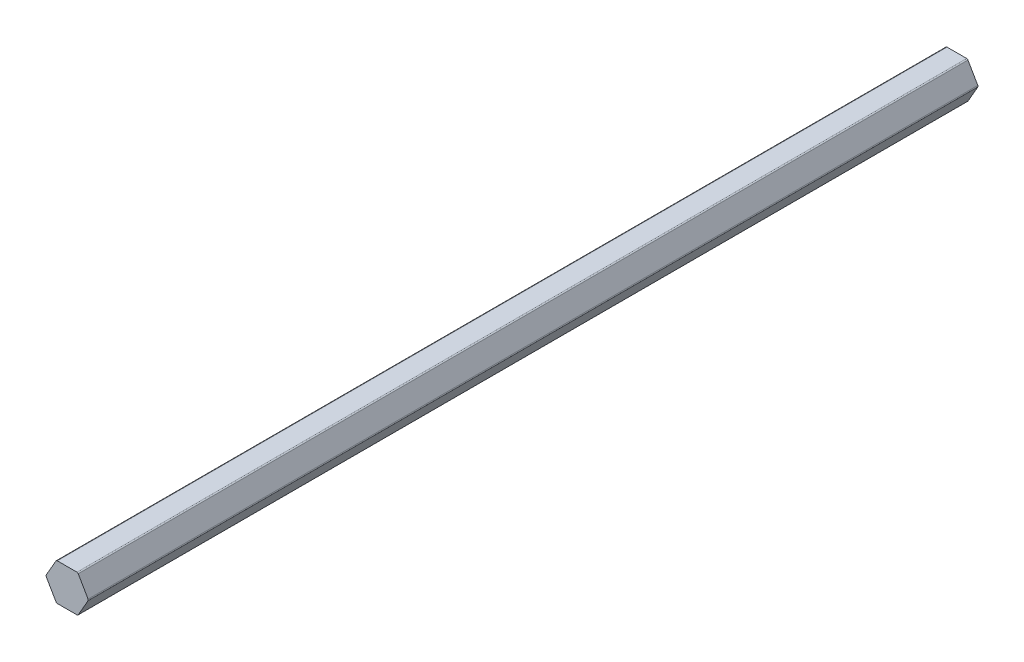
ISO-10303-21;
HEADER;
FILE_DESCRIPTION(('STEP AP214'),'2;1');
FILE_NAME('part.step','',(''),(''),'','','');
FILE_SCHEMA(('AUTOMOTIVE_DESIGN { 1 0 10303 214 1 1 1 1 }'));
ENDSEC;
DATA;
#1=APPLICATION_CONTEXT('core data for automotive mechanical design processes');
#2=APPLICATION_PROTOCOL_DEFINITION('international standard','automotive_design',2000,#1);
#3=PRODUCT_CONTEXT('',#1,'mechanical');
#4=PRODUCT('Part','Part','',(#3));
#5=PRODUCT_RELATED_PRODUCT_CATEGORY('part','',(#4));
#6=PRODUCT_DEFINITION_FORMATION('','',#4);
#7=PRODUCT_DEFINITION_CONTEXT('part definition',#1,'design');
#8=PRODUCT_DEFINITION('design','',#6,#7);
#9=PRODUCT_DEFINITION_SHAPE('','',#8);
#10=(LENGTH_UNIT() NAMED_UNIT(*) SI_UNIT(.MILLI.,.METRE.));
#11=(NAMED_UNIT(*) PLANE_ANGLE_UNIT() SI_UNIT($,.RADIAN.));
#12=(NAMED_UNIT(*) SI_UNIT($,.STERADIAN.) SOLID_ANGLE_UNIT());
#13=UNCERTAINTY_MEASURE_WITH_UNIT(LENGTH_MEASURE(1.E-05),#10,'distance_accuracy_value','');
#14=(GEOMETRIC_REPRESENTATION_CONTEXT(3) GLOBAL_UNCERTAINTY_ASSIGNED_CONTEXT((#13)) GLOBAL_UNIT_ASSIGNED_CONTEXT((#10,
#11,#12)) REPRESENTATION_CONTEXT('',''));
#15=CARTESIAN_POINT('',(0.,0.,0.));
#16=DIRECTION('',(0.,0.,1.));
#17=DIRECTION('',(1.,0.,0.));
#18=AXIS2_PLACEMENT_3D('',#15,#16,#17);
#19=CARTESIAN_POINT('',(-6.73109584837417,0.,457.2));
#20=DIRECTION('',(0.,0.,-1.));
#21=DIRECTION('',(-1.,0.,0.));
#22=AXIS2_PLACEMENT_3D('',#19,#20,#21);
#23=CYLINDRICAL_SURFACE('',#22,0.508);
#24=CARTESIAN_POINT('',(-6.73109584837417,0.,-152.4));
#25=DIRECTION('',(0.,0.,-1.));
#26=DIRECTION('',(-1.,0.,0.));
#27=AXIS2_PLACEMENT_3D('',#24,#25,#26);
#28=CIRCLE('',#27,0.508);
#29=CARTESIAN_POINT('',(-7.23909584837417,0.,-152.4));
#30=VERTEX_POINT('',#29);
#31=CARTESIAN_POINT('',(-7.17103675349666,-0.254000000000007,-152.4));
#32=VERTEX_POINT('',#31);
#33=EDGE_CURVE('E264',#30,#32,#28,.F.);
#34=ORIENTED_EDGE('',*,*,#33,.F.);
#35=DIRECTION('',(0.,0.,-1.));
#36=VECTOR('',#35,1.);
#37=CARTESIAN_POINT('',(-7.23909584837417,0.,457.2));
#38=LINE('',#37,#36);
#39=CARTESIAN_POINT('',(-7.23909584837417,0.,-457.2));
#40=VERTEX_POINT('',#39);
#41=EDGE_CURVE('E52',#30,#40,#38,.T.);
#42=ORIENTED_EDGE('',*,*,#41,.T.);
#43=CARTESIAN_POINT('',(-6.73109584837417,0.,-457.2));
#44=DIRECTION('',(0.,0.,-1.));
#45=DIRECTION('',(1.,0.,0.));
#46=AXIS2_PLACEMENT_3D('',#43,#44,#45);
#47=CIRCLE('',#46,0.508);
#48=CARTESIAN_POINT('',(-7.17103675349666,-0.254000000000004,-457.2));
#49=VERTEX_POINT('',#48);
#50=EDGE_CURVE('E192',#49,#40,#47,.T.);
#51=ORIENTED_EDGE('',*,*,#50,.F.);
#52=DIRECTION('',(0.,0.,-1.));
#53=VECTOR('',#52,1.);
#54=CARTESIAN_POINT('',(-7.17103675349666,-0.254000000000004,457.2));
#55=LINE('',#54,#53);
#56=EDGE_CURVE('E217',#32,#49,#55,.T.);
#57=ORIENTED_EDGE('',*,*,#56,.F.);
#58=EDGE_LOOP('',(#34,#42,#51,#57));
#59=FACE_BOUND('',#58,.T.);
#60=ADVANCED_FACE('F44',(#59),#23,.T.);
#61=CARTESIAN_POINT('',(3.65884186093541,-6.3373,457.2));
#62=DIRECTION('',(-0.866025403784439,0.5,0.));
#63=DIRECTION('',(0.,0.,1.));
#64=AXIS2_PLACEMENT_3D('',#61,#62,#63);
#65=PLANE('',#64);
#66=DIRECTION('',(0.,0.,1.));
#67=VECTOR('',#66,1.);
#68=CARTESIAN_POINT('',(7.17103675349667,-0.253999999999996,457.2));
#69=LINE('',#68,#67);
#70=CARTESIAN_POINT('',(7.17103675349666,-0.254,-457.2));
#71=VERTEX_POINT('',#70);
#72=CARTESIAN_POINT('',(7.17103675349666,-0.254000000000001,-152.4));
#73=VERTEX_POINT('',#72);
#74=EDGE_CURVE('E179',#71,#73,#69,.T.);
#75=ORIENTED_EDGE('',*,*,#74,.T.);
#76=DIRECTION('',(-0.5,-0.866025403784439,0.));
#77=VECTOR('',#76,1.);
#78=CARTESIAN_POINT('',(3.65884186093541,-6.3373,-152.4));
#79=LINE('',#78,#77);
#80=CARTESIAN_POINT('',(3.80548882930958,-6.0833,-152.4));
#81=VERTEX_POINT('',#80);
#82=EDGE_CURVE('E254',#73,#81,#79,.T.);
#83=ORIENTED_EDGE('',*,*,#82,.T.);
#84=DIRECTION('',(0.,0.,-1.));
#85=VECTOR('',#84,1.);
#86=CARTESIAN_POINT('',(3.80548882930958,-6.0833,457.2));
#87=LINE('',#86,#85);
#88=CARTESIAN_POINT('',(3.80548882930958,-6.0833,-457.2));
#89=VERTEX_POINT('',#88);
#90=EDGE_CURVE('E209',#81,#89,#87,.T.);
#91=ORIENTED_EDGE('',*,*,#90,.T.);
#92=DIRECTION('',(0.5,0.866025403784439,0.));
#93=VECTOR('',#92,1.);
#94=CARTESIAN_POINT('',(3.65884186093541,-6.3373,-457.2));
#95=LINE('',#94,#93);
#96=EDGE_CURVE('E205',#89,#71,#95,.T.);
#97=ORIENTED_EDGE('',*,*,#96,.T.);
#98=EDGE_LOOP('',(#75,#83,#91,#97));
#99=FACE_BOUND('',#98,.T.);
#100=ADVANCED_FACE('F293',(#99),#65,.F.);
#101=CARTESIAN_POINT('',(7.31768372187083,0.,457.2));
#102=DIRECTION('',(-0.866025403784439,-0.5,0.));
#103=DIRECTION('',(-0.5,0.866025403784439,0.));
#104=AXIS2_PLACEMENT_3D('',#101,#102,#103);
#105=PLANE('',#104);
#106=DIRECTION('',(0.,0.,1.));
#107=VECTOR('',#106,1.);
#108=CARTESIAN_POINT('',(3.80548882930958,6.0833,457.2));
#109=LINE('',#108,#107);
#110=CARTESIAN_POINT('',(3.80548882930957,6.0833,-457.2));
#111=VERTEX_POINT('',#110);
#112=CARTESIAN_POINT('',(3.80548882930958,6.0833,-152.4));
#113=VERTEX_POINT('',#112);
#114=EDGE_CURVE('E187',#111,#113,#109,.T.);
#115=ORIENTED_EDGE('',*,*,#114,.T.);
#116=DIRECTION('',(0.5,-0.866025403784439,0.));
#117=VECTOR('',#116,1.);
#118=CARTESIAN_POINT('',(7.31768372187083,0.,-152.4));
#119=LINE('',#118,#117);
#120=CARTESIAN_POINT('',(7.17103675349667,0.254000000000004,-152.4));
#121=VERTEX_POINT('',#120);
#122=EDGE_CURVE('E58',#113,#121,#119,.T.);
#123=ORIENTED_EDGE('',*,*,#122,.T.);
#124=DIRECTION('',(0.,0.,-1.));
#125=VECTOR('',#124,1.);
#126=CARTESIAN_POINT('',(7.17103675349666,0.254,457.2));
#127=LINE('',#126,#125);
#128=CARTESIAN_POINT('',(7.17103675349666,0.254000000000004,-457.2));
#129=VERTEX_POINT('',#128);
#130=EDGE_CURVE('E181',#121,#129,#127,.T.);
#131=ORIENTED_EDGE('',*,*,#130,.T.);
#132=DIRECTION('',(-0.5,0.866025403784439,0.));
#133=VECTOR('',#132,1.);
#134=CARTESIAN_POINT('',(7.31768372187083,0.,-457.2));
#135=LINE('',#134,#133);
#136=EDGE_CURVE('E183',#129,#111,#135,.T.);
#137=ORIENTED_EDGE('',*,*,#136,.T.);
#138=EDGE_LOOP('',(#115,#123,#131,#137));
#139=FACE_BOUND('',#138,.T.);
#140=ADVANCED_FACE('F298',(#139),#105,.F.);
#141=CARTESIAN_POINT('',(3.65884186093541,6.3373,457.2));
#142=DIRECTION('',(0.,-1.,0.));
#143=DIRECTION('',(0.,0.,-1.));
#144=AXIS2_PLACEMENT_3D('',#141,#142,#143);
#145=PLANE('',#144);
#146=DIRECTION('',(0.,0.,1.));
#147=VECTOR('',#146,1.);
#148=CARTESIAN_POINT('',(-3.36554792418709,6.3373,457.2));
#149=LINE('',#148,#147);
#150=CARTESIAN_POINT('',(-3.36554792418708,6.3373,-457.2));
#151=VERTEX_POINT('',#150);
#152=CARTESIAN_POINT('',(-3.36554792418708,6.3373,-152.4));
#153=VERTEX_POINT('',#152);
#154=EDGE_CURVE('E162',#151,#153,#149,.T.);
#155=ORIENTED_EDGE('',*,*,#154,.T.);
#156=DIRECTION('',(1.,0.,0.));
#157=VECTOR('',#156,1.);
#158=CARTESIAN_POINT('',(3.65884186093541,6.3373,-152.4));
#159=LINE('',#158,#157);
#160=CARTESIAN_POINT('',(3.36554792418709,6.3373,-152.4));
#161=VERTEX_POINT('',#160);
#162=EDGE_CURVE('E152',#153,#161,#159,.T.);
#163=ORIENTED_EDGE('',*,*,#162,.T.);
#164=DIRECTION('',(0.,0.,-1.));
#165=VECTOR('',#164,1.);
#166=CARTESIAN_POINT('',(3.36554792418709,6.3373,457.2));
#167=LINE('',#166,#165);
#168=CARTESIAN_POINT('',(3.36554792418709,6.3373,-457.2));
#169=VERTEX_POINT('',#168);
#170=EDGE_CURVE('E160',#161,#169,#167,.T.);
#171=ORIENTED_EDGE('',*,*,#170,.T.);
#172=DIRECTION('',(-1.,0.,0.));
#173=VECTOR('',#172,1.);
#174=CARTESIAN_POINT('',(3.65884186093541,6.3373,-457.2));
#175=LINE('',#174,#173);
#176=EDGE_CURVE('E171',#169,#151,#175,.T.);
#177=ORIENTED_EDGE('',*,*,#176,.T.);
#178=EDGE_LOOP('',(#155,#163,#171,#177));
#179=FACE_BOUND('',#178,.T.);
#180=ADVANCED_FACE('F46',(#179),#145,.F.);
#181=CARTESIAN_POINT('',(-3.65884186093541,6.3373,457.2));
#182=DIRECTION('',(0.866025403784439,-0.5,0.));
#183=DIRECTION('',(0.,0.,-1.));
#184=AXIS2_PLACEMENT_3D('',#181,#182,#183);
#185=PLANE('',#184);
#186=DIRECTION('',(0.,0.,1.));
#187=VECTOR('',#186,1.);
#188=CARTESIAN_POINT('',(-7.17103675349666,0.253999999999995,457.2));
#189=LINE('',#188,#187);
#190=CARTESIAN_POINT('',(-7.17103675349666,0.253999999999997,-457.2));
#191=VERTEX_POINT('',#190);
#192=CARTESIAN_POINT('',(-7.17103675349667,0.253999999999996,-152.4));
#193=VERTEX_POINT('',#192);
#194=EDGE_CURVE('E175',#191,#193,#189,.T.);
#195=ORIENTED_EDGE('',*,*,#194,.T.);
#196=DIRECTION('',(0.5,0.866025403784439,0.));
#197=VECTOR('',#196,1.);
#198=CARTESIAN_POINT('',(-3.65884186093541,6.3373,-152.4));
#199=LINE('',#198,#197);
#200=CARTESIAN_POINT('',(-3.80548882930958,6.0833,-152.4));
#201=VERTEX_POINT('',#200);
#202=EDGE_CURVE('E249',#193,#201,#199,.T.);
#203=ORIENTED_EDGE('',*,*,#202,.T.);
#204=DIRECTION('',(0.,0.,-1.));
#205=VECTOR('',#204,1.);
#206=CARTESIAN_POINT('',(-3.80548882930958,6.0833,457.2));
#207=LINE('',#206,#205);
#208=CARTESIAN_POINT('',(-3.80548882930958,6.0833,-457.2));
#209=VERTEX_POINT('',#208);
#210=EDGE_CURVE('E224',#201,#209,#207,.T.);
#211=ORIENTED_EDGE('',*,*,#210,.T.);
#212=DIRECTION('',(-0.5,-0.866025403784439,0.));
#213=VECTOR('',#212,1.);
#214=CARTESIAN_POINT('',(-3.65884186093541,6.3373,-457.2));
#215=LINE('',#214,#213);
#216=EDGE_CURVE('E168',#209,#191,#215,.T.);
#217=ORIENTED_EDGE('',*,*,#216,.T.);
#218=EDGE_LOOP('',(#195,#203,#211,#217));
#219=FACE_BOUND('',#218,.T.);
#220=ADVANCED_FACE('F291',(#219),#185,.F.);
#221=CARTESIAN_POINT('',(-7.31768372187083,0.,457.2));
#222=DIRECTION('',(0.866025403784438,0.5,0.));
#223=DIRECTION('',(0.,0.,-1.));
#224=AXIS2_PLACEMENT_3D('',#221,#222,#223);
#225=PLANE('',#224);
#226=DIRECTION('',(0.,0.,1.));
#227=VECTOR('',#226,1.);
#228=CARTESIAN_POINT('',(-3.80548882930957,-6.0833,457.2));
#229=LINE('',#228,#227);
#230=CARTESIAN_POINT('',(-3.80548882930957,-6.0833,-457.2));
#231=VERTEX_POINT('',#230);
#232=CARTESIAN_POINT('',(-3.80548882930958,-6.0833,-152.4));
#233=VERTEX_POINT('',#232);
#234=EDGE_CURVE('E213',#231,#233,#229,.T.);
#235=ORIENTED_EDGE('',*,*,#234,.T.);
#236=DIRECTION('',(-0.5,0.866025403784438,0.));
#237=VECTOR('',#236,1.);
#238=CARTESIAN_POINT('',(-7.31768372187083,0.,-152.4));
#239=LINE('',#238,#237);
#240=EDGE_CURVE('E268',#233,#32,#239,.T.);
#241=ORIENTED_EDGE('',*,*,#240,.T.);
#242=ORIENTED_EDGE('',*,*,#56,.T.);
#243=DIRECTION('',(0.5,-0.866025403784439,0.));
#244=VECTOR('',#243,1.);
#245=CARTESIAN_POINT('',(-7.31768372187083,0.,-457.2));
#246=LINE('',#245,#244);
#247=EDGE_CURVE('E216',#49,#231,#246,.T.);
#248=ORIENTED_EDGE('',*,*,#247,.T.);
#249=EDGE_LOOP('',(#235,#241,#242,#248));
#250=FACE_BOUND('',#249,.T.);
#251=ADVANCED_FACE('F307',(#250),#225,.F.);
#252=CARTESIAN_POINT('',(-3.6588418609354,-6.3373,457.2));
#253=DIRECTION('',(0.,1.,0.));
#254=DIRECTION('',(1.,0.,0.));
#255=AXIS2_PLACEMENT_3D('',#252,#253,#254);
#256=PLANE('',#255);
#257=DIRECTION('',(0.,0.,1.));
#258=VECTOR('',#257,1.);
#259=CARTESIAN_POINT('',(3.36554792418709,-6.3373,457.2));
#260=LINE('',#259,#258);
#261=CARTESIAN_POINT('',(3.36554792418709,-6.3373,-457.2));
#262=VERTEX_POINT('',#261);
#263=CARTESIAN_POINT('',(3.36554792418709,-6.3373,-152.4));
#264=VERTEX_POINT('',#263);
#265=EDGE_CURVE('E191',#262,#264,#260,.T.);
#266=ORIENTED_EDGE('',*,*,#265,.T.);
#267=DIRECTION('',(-1.,0.,0.));
#268=VECTOR('',#267,1.);
#269=CARTESIAN_POINT('',(-3.6588418609354,-6.3373,-152.4));
#270=LINE('',#269,#268);
#271=CARTESIAN_POINT('',(-3.36554792418708,-6.3373,-152.4));
#272=VERTEX_POINT('',#271);
#273=EDGE_CURVE('E261',#264,#272,#270,.T.);
#274=ORIENTED_EDGE('',*,*,#273,.T.);
#275=DIRECTION('',(0.,0.,-1.));
#276=VECTOR('',#275,1.);
#277=CARTESIAN_POINT('',(-3.36554792418708,-6.3373,457.2));
#278=LINE('',#277,#276);
#279=CARTESIAN_POINT('',(-3.36554792418708,-6.3373,-457.2));
#280=VERTEX_POINT('',#279);
#281=EDGE_CURVE('E226',#272,#280,#278,.T.);
#282=ORIENTED_EDGE('',*,*,#281,.T.);
#283=DIRECTION('',(1.,0.,0.));
#284=VECTOR('',#283,1.);
#285=CARTESIAN_POINT('',(-3.6588418609354,-6.3373,-457.2));
#286=LINE('',#285,#284);
#287=EDGE_CURVE('E197',#280,#262,#286,.T.);
#288=ORIENTED_EDGE('',*,*,#287,.T.);
#289=EDGE_LOOP('',(#266,#274,#282,#288));
#290=FACE_BOUND('',#289,.T.);
#291=ADVANCED_FACE('F310',(#290),#256,.F.);
#292=CARTESIAN_POINT('',(7.31768372187083,0.,-457.2));
#293=DIRECTION('',(0.,0.,1.));
#294=DIRECTION('',(1.,0.,0.));
#295=AXIS2_PLACEMENT_3D('',#292,#293,#294);
#296=PLANE('',#295);
#297=ORIENTED_EDGE('',*,*,#287,.F.);
#298=CARTESIAN_POINT('',(-3.36554792418708,-5.8293,-457.2));
#299=DIRECTION('',(0.,0.,-1.));
#300=DIRECTION('',(1.,0.,0.));
#301=AXIS2_PLACEMENT_3D('',#298,#299,#300);
#302=CIRCLE('',#301,0.508);
#303=EDGE_CURVE('E188',#280,#231,#302,.T.);
#304=ORIENTED_EDGE('',*,*,#303,.T.);
#305=ORIENTED_EDGE('',*,*,#247,.F.);
#306=ORIENTED_EDGE('',*,*,#50,.T.);
#307=CARTESIAN_POINT('',(-6.73109584837417,0.,-457.2));
#308=DIRECTION('',(0.,0.,-1.));
#309=DIRECTION('',(1.,0.,0.));
#310=AXIS2_PLACEMENT_3D('',#307,#308,#309);
#311=CIRCLE('',#310,0.508);
#312=EDGE_CURVE('E203',#40,#191,#311,.T.);
#313=ORIENTED_EDGE('',*,*,#312,.T.);
#314=ORIENTED_EDGE('',*,*,#216,.F.);
#315=CARTESIAN_POINT('',(-3.36554792418709,5.8293,-457.2));
#316=DIRECTION('',(0.,0.,-1.));
#317=DIRECTION('',(1.,0.,0.));
#318=AXIS2_PLACEMENT_3D('',#315,#316,#317);
#319=CIRCLE('',#318,0.508);
#320=EDGE_CURVE('E200',#209,#151,#319,.T.);
#321=ORIENTED_EDGE('',*,*,#320,.T.);
#322=ORIENTED_EDGE('',*,*,#176,.F.);
#323=CARTESIAN_POINT('',(3.36554792418709,5.8293,-457.2));
#324=DIRECTION('',(0.,0.,-1.));
#325=DIRECTION('',(1.,0.,0.));
#326=AXIS2_PLACEMENT_3D('',#323,#324,#325);
#327=CIRCLE('',#326,0.508);
#328=EDGE_CURVE('E167',#169,#111,#327,.T.);
#329=ORIENTED_EDGE('',*,*,#328,.T.);
#330=ORIENTED_EDGE('',*,*,#136,.F.);
#331=CARTESIAN_POINT('',(6.73109584837417,0.,-457.2));
#332=DIRECTION('',(0.,0.,-1.));
#333=DIRECTION('',(1.,0.,0.));
#334=AXIS2_PLACEMENT_3D('',#331,#332,#333);
#335=CIRCLE('',#334,0.508);
#336=EDGE_CURVE('E212',#129,#71,#335,.T.);
#337=ORIENTED_EDGE('',*,*,#336,.T.);
#338=ORIENTED_EDGE('',*,*,#96,.F.);
#339=CARTESIAN_POINT('',(3.36554792418709,-5.8293,-457.2));
#340=DIRECTION('',(0.,0.,-1.));
#341=DIRECTION('',(1.,0.,0.));
#342=AXIS2_PLACEMENT_3D('',#339,#340,#341);
#343=CIRCLE('',#342,0.508);
#344=EDGE_CURVE('E270',#89,#262,#343,.T.);
#345=ORIENTED_EDGE('',*,*,#344,.T.);
#346=EDGE_LOOP('',(#297,#304,#305,#306,#313,#314,#321,#322,#329,#330,#337,#338,#345));
#347=FACE_BOUND('',#346,.T.);
#348=ADVANCED_FACE('F240',(#347),#296,.F.);
#349=CARTESIAN_POINT('',(-3.36554792418708,-5.8293,457.2));
#350=DIRECTION('',(0.,0.,-1.));
#351=DIRECTION('',(-1.,0.,0.));
#352=AXIS2_PLACEMENT_3D('',#349,#350,#351);
#353=CYLINDRICAL_SURFACE('',#352,0.508);
#354=CARTESIAN_POINT('',(-3.36554792418708,-5.8293,-152.4));
#355=DIRECTION('',(0.,0.,-1.));
#356=DIRECTION('',(-1.,0.,0.));
#357=AXIS2_PLACEMENT_3D('',#354,#355,#356);
#358=CIRCLE('',#357,0.508);
#359=EDGE_CURVE('E266',#233,#272,#358,.F.);
#360=ORIENTED_EDGE('',*,*,#359,.F.);
#361=ORIENTED_EDGE('',*,*,#234,.F.);
#362=ORIENTED_EDGE('',*,*,#303,.F.);
#363=ORIENTED_EDGE('',*,*,#281,.F.);
#364=EDGE_LOOP('',(#360,#361,#362,#363));
#365=FACE_BOUND('',#364,.T.);
#366=ADVANCED_FACE('F303',(#365),#353,.T.);
#367=CARTESIAN_POINT('',(-6.73109584837417,0.,457.2));
#368=DIRECTION('',(0.,0.,-1.));
#369=DIRECTION('',(-1.,0.,0.));
#370=AXIS2_PLACEMENT_3D('',#367,#368,#369);
#371=CYLINDRICAL_SURFACE('',#370,0.508);
#372=CARTESIAN_POINT('',(-6.73109584837417,0.,-152.4));
#373=DIRECTION('',(0.,0.,-1.));
#374=DIRECTION('',(-1.,0.,0.));
#375=AXIS2_PLACEMENT_3D('',#372,#373,#374);
#376=CIRCLE('',#375,0.508);
#377=EDGE_CURVE('E259',#193,#30,#376,.F.);
#378=ORIENTED_EDGE('',*,*,#377,.F.);
#379=ORIENTED_EDGE('',*,*,#194,.F.);
#380=ORIENTED_EDGE('',*,*,#312,.F.);
#381=ORIENTED_EDGE('',*,*,#41,.F.);
#382=EDGE_LOOP('',(#378,#379,#380,#381));
#383=FACE_BOUND('',#382,.T.);
#384=ADVANCED_FACE('F289',(#383),#371,.T.);
#385=CARTESIAN_POINT('',(3.36554792418709,-5.8293,457.2));
#386=DIRECTION('',(0.,0.,-1.));
#387=DIRECTION('',(-1.,0.,0.));
#388=AXIS2_PLACEMENT_3D('',#385,#386,#387);
#389=CYLINDRICAL_SURFACE('',#388,0.508);
#390=CARTESIAN_POINT('',(3.36554792418709,-5.8293,-152.4));
#391=DIRECTION('',(0.,0.,-1.));
#392=DIRECTION('',(-1.,0.,0.));
#393=AXIS2_PLACEMENT_3D('',#390,#391,#392);
#394=CIRCLE('',#393,0.508);
#395=EDGE_CURVE('E257',#264,#81,#394,.F.);
#396=ORIENTED_EDGE('',*,*,#395,.F.);
#397=ORIENTED_EDGE('',*,*,#265,.F.);
#398=ORIENTED_EDGE('',*,*,#344,.F.);
#399=ORIENTED_EDGE('',*,*,#90,.F.);
#400=EDGE_LOOP('',(#396,#397,#398,#399));
#401=FACE_BOUND('',#400,.T.);
#402=ADVANCED_FACE('F311',(#401),#389,.T.);
#403=CARTESIAN_POINT('',(6.73109584837417,0.,457.2));
#404=DIRECTION('',(0.,0.,-1.));
#405=DIRECTION('',(-1.,0.,0.));
#406=AXIS2_PLACEMENT_3D('',#403,#404,#405);
#407=CYLINDRICAL_SURFACE('',#406,0.508);
#408=CARTESIAN_POINT('',(6.73109584837417,0.,-152.4));
#409=DIRECTION('',(0.,0.,-1.));
#410=DIRECTION('',(-1.,0.,0.));
#411=AXIS2_PLACEMENT_3D('',#408,#409,#410);
#412=CIRCLE('',#411,0.508);
#413=EDGE_CURVE('E247',#73,#121,#412,.F.);
#414=ORIENTED_EDGE('',*,*,#413,.F.);
#415=ORIENTED_EDGE('',*,*,#74,.F.);
#416=ORIENTED_EDGE('',*,*,#336,.F.);
#417=ORIENTED_EDGE('',*,*,#130,.F.);
#418=EDGE_LOOP('',(#414,#415,#416,#417));
#419=FACE_BOUND('',#418,.T.);
#420=ADVANCED_FACE('F313',(#419),#407,.T.);
#421=CARTESIAN_POINT('',(-3.36554792418709,5.8293,457.2));
#422=DIRECTION('',(0.,0.,-1.));
#423=DIRECTION('',(-1.,0.,0.));
#424=AXIS2_PLACEMENT_3D('',#421,#422,#423);
#425=CYLINDRICAL_SURFACE('',#424,0.508);
#426=CARTESIAN_POINT('',(-3.36554792418709,5.8293,-152.4));
#427=DIRECTION('',(0.,0.,-1.));
#428=DIRECTION('',(-1.,0.,0.));
#429=AXIS2_PLACEMENT_3D('',#426,#427,#428);
#430=CIRCLE('',#429,0.508);
#431=EDGE_CURVE('E245',#153,#201,#430,.F.);
#432=ORIENTED_EDGE('',*,*,#431,.F.);
#433=ORIENTED_EDGE('',*,*,#154,.F.);
#434=ORIENTED_EDGE('',*,*,#320,.F.);
#435=ORIENTED_EDGE('',*,*,#210,.F.);
#436=EDGE_LOOP('',(#432,#433,#434,#435));
#437=FACE_BOUND('',#436,.T.);
#438=ADVANCED_FACE('F244',(#437),#425,.T.);
#439=CARTESIAN_POINT('',(3.36554792418709,5.8293,457.2));
#440=DIRECTION('',(0.,0.,-1.));
#441=DIRECTION('',(-1.,0.,0.));
#442=AXIS2_PLACEMENT_3D('',#439,#440,#441);
#443=CYLINDRICAL_SURFACE('',#442,0.508);
#444=CARTESIAN_POINT('',(3.36554792418709,5.8293,-152.4));
#445=DIRECTION('',(0.,0.,-1.));
#446=DIRECTION('',(-1.,0.,0.));
#447=AXIS2_PLACEMENT_3D('',#444,#445,#446);
#448=CIRCLE('',#447,0.508);
#449=EDGE_CURVE('E11',#113,#161,#448,.F.);
#450=ORIENTED_EDGE('',*,*,#449,.F.);
#451=ORIENTED_EDGE('',*,*,#114,.F.);
#452=ORIENTED_EDGE('',*,*,#328,.F.);
#453=ORIENTED_EDGE('',*,*,#170,.F.);
#454=EDGE_LOOP('',(#450,#451,#452,#453));
#455=FACE_BOUND('',#454,.T.);
#456=ADVANCED_FACE('F165',(#455),#443,.T.);
#457=CARTESIAN_POINT('',(0.,0.,-152.4));
#458=DIRECTION('',(0.,0.,-1.));
#459=DIRECTION('',(-1.,0.,0.));
#460=AXIS2_PLACEMENT_3D('',#457,#458,#459);
#461=PLANE('',#460);
#462=ORIENTED_EDGE('',*,*,#359,.T.);
#463=ORIENTED_EDGE('',*,*,#273,.F.);
#464=ORIENTED_EDGE('',*,*,#395,.T.);
#465=ORIENTED_EDGE('',*,*,#82,.F.);
#466=ORIENTED_EDGE('',*,*,#413,.T.);
#467=ORIENTED_EDGE('',*,*,#122,.F.);
#468=ORIENTED_EDGE('',*,*,#449,.T.);
#469=ORIENTED_EDGE('',*,*,#162,.F.);
#470=ORIENTED_EDGE('',*,*,#431,.T.);
#471=ORIENTED_EDGE('',*,*,#202,.F.);
#472=ORIENTED_EDGE('',*,*,#377,.T.);
#473=ORIENTED_EDGE('',*,*,#33,.T.);
#474=ORIENTED_EDGE('',*,*,#240,.F.);
#475=EDGE_LOOP('',(#462,#463,#464,#465,#466,#467,#468,#469,#470,#471,#472,#473,#474));
#476=FACE_BOUND('',#475,.T.);
#477=ADVANCED_FACE('F151',(#476),#461,.F.);
#478=CLOSED_SHELL('',(#60,#100,#140,#180,#220,#251,#291,#348,#366,#384,#402,#420,#438,#456,#477));
#479=MANIFOLD_SOLID_BREP('B2',#478);
#480=ADVANCED_BREP_SHAPE_REPRESENTATION('',(#18,#479),#14);
#481=SHAPE_DEFINITION_REPRESENTATION(#9,#480);
ENDSEC;
END-ISO-10303-21;
